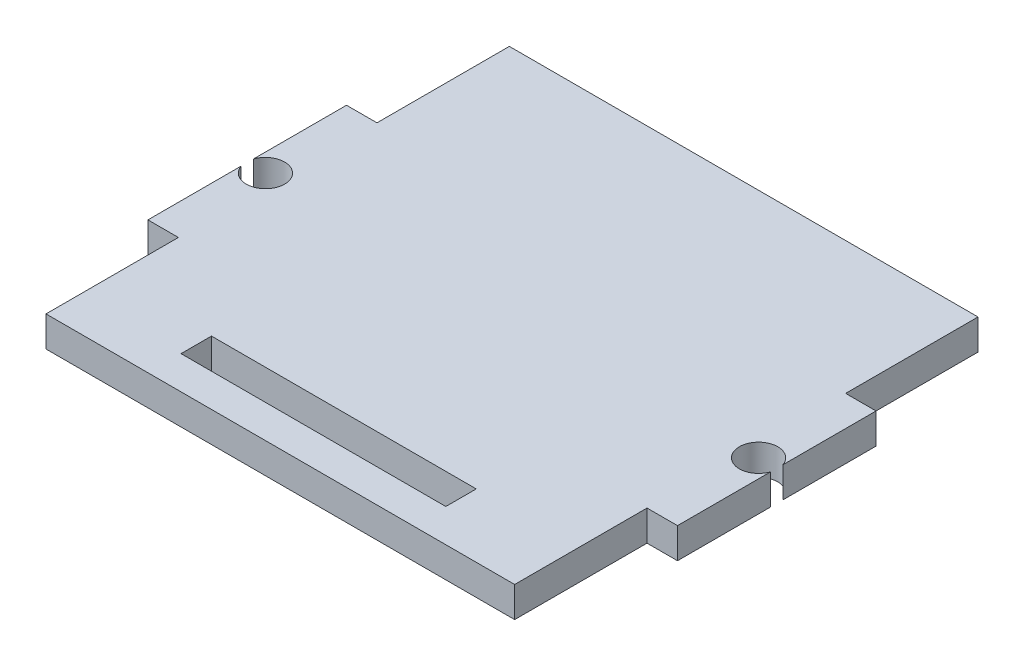
ISO-10303-21;
HEADER;
FILE_DESCRIPTION(('STEP AP214'),'2;1');
FILE_NAME('part.step','',(''),(''),'','','');
FILE_SCHEMA(('AUTOMOTIVE_DESIGN { 1 0 10303 214 1 1 1 1 }'));
ENDSEC;
DATA;
#1=APPLICATION_CONTEXT('core data for automotive mechanical design processes');
#2=APPLICATION_PROTOCOL_DEFINITION('international standard','automotive_design',2000,#1);
#3=PRODUCT_CONTEXT('',#1,'mechanical');
#4=PRODUCT('Part','Part','',(#3));
#5=PRODUCT_RELATED_PRODUCT_CATEGORY('part','',(#4));
#6=PRODUCT_DEFINITION_FORMATION('','',#4);
#7=PRODUCT_DEFINITION_CONTEXT('part definition',#1,'design');
#8=PRODUCT_DEFINITION('design','',#6,#7);
#9=PRODUCT_DEFINITION_SHAPE('','',#8);
#10=(LENGTH_UNIT() NAMED_UNIT(*) SI_UNIT(.MILLI.,.METRE.));
#11=(NAMED_UNIT(*) PLANE_ANGLE_UNIT() SI_UNIT($,.RADIAN.));
#12=(NAMED_UNIT(*) SI_UNIT($,.STERADIAN.) SOLID_ANGLE_UNIT());
#13=UNCERTAINTY_MEASURE_WITH_UNIT(LENGTH_MEASURE(1.E-05),#10,'distance_accuracy_value','');
#14=(GEOMETRIC_REPRESENTATION_CONTEXT(3) GLOBAL_UNCERTAINTY_ASSIGNED_CONTEXT((#13)) GLOBAL_UNIT_ASSIGNED_CONTEXT((#10,
#11,#12)) REPRESENTATION_CONTEXT('',''));
#15=CARTESIAN_POINT('',(0.,0.,0.));
#16=DIRECTION('',(0.,0.,1.));
#17=DIRECTION('',(1.,0.,0.));
#18=AXIS2_PLACEMENT_3D('',#15,#16,#17);
#19=CARTESIAN_POINT('',(1.74625,2.921,-22.225));
#20=DIRECTION('',(0.,1.,0.));
#21=DIRECTION('',(0.,0.,1.));
#22=AXIS2_PLACEMENT_3D('',#19,#20,#21);
#23=PLANE('',#22);
#24=CARTESIAN_POINT('',(1.74625,2.921,-22.225));
#25=DIRECTION('',(0.,-1.,0.));
#26=DIRECTION('',(0.,0.,1.));
#27=AXIS2_PLACEMENT_3D('',#24,#25,#26);
#28=CIRCLE('',#27,1.8415);
#29=CARTESIAN_POINT('',(0.,2.921,-22.8095794963048));
#30=VERTEX_POINT('',#29);
#31=CARTESIAN_POINT('',(0.,2.921,-21.6404205036952));
#32=VERTEX_POINT('',#31);
#33=EDGE_CURVE('E206',#30,#32,#28,.T.);
#34=ORIENTED_EDGE('',*,*,#33,.T.);
#35=DIRECTION('',(0.,0.,1.));
#36=VECTOR('',#35,1.);
#37=CARTESIAN_POINT('',(0.,2.921,-12.7));
#38=LINE('',#37,#36);
#39=CARTESIAN_POINT('',(0.,2.921,-12.7));
#40=VERTEX_POINT('',#39);
#41=EDGE_CURVE('E209',#32,#40,#38,.T.);
#42=ORIENTED_EDGE('',*,*,#41,.T.);
#43=DIRECTION('',(1.,0.,0.));
#44=VECTOR('',#43,1.);
#45=CARTESIAN_POINT('',(0.,2.921,-12.7));
#46=LINE('',#45,#44);
#47=CARTESIAN_POINT('',(2.921,2.921,-12.7));
#48=VERTEX_POINT('',#47);
#49=EDGE_CURVE('E212',#40,#48,#46,.T.);
#50=ORIENTED_EDGE('',*,*,#49,.T.);
#51=DIRECTION('',(0.,0.,1.));
#52=VECTOR('',#51,1.);
#53=CARTESIAN_POINT('',(2.921,2.921,0.));
#54=LINE('',#53,#52);
#55=CARTESIAN_POINT('',(2.921,2.921,0.));
#56=VERTEX_POINT('',#55);
#57=EDGE_CURVE('E214',#48,#56,#54,.T.);
#58=ORIENTED_EDGE('',*,*,#57,.T.);
#59=DIRECTION('',(1.,0.,0.));
#60=VECTOR('',#59,1.);
#61=CARTESIAN_POINT('',(2.921,2.921,0.));
#62=LINE('',#61,#60);
#63=CARTESIAN_POINT('',(47.879,2.921,0.));
#64=VERTEX_POINT('',#63);
#65=EDGE_CURVE('E216',#56,#64,#62,.T.);
#66=ORIENTED_EDGE('',*,*,#65,.T.);
#67=DIRECTION('',(0.,0.,-1.));
#68=VECTOR('',#67,1.);
#69=CARTESIAN_POINT('',(47.879,2.921,0.));
#70=LINE('',#69,#68);
#71=CARTESIAN_POINT('',(47.879,2.921,-12.7));
#72=VERTEX_POINT('',#71);
#73=EDGE_CURVE('E218',#64,#72,#70,.T.);
#74=ORIENTED_EDGE('',*,*,#73,.T.);
#75=DIRECTION('',(1.,0.,0.));
#76=VECTOR('',#75,1.);
#77=CARTESIAN_POINT('',(50.8,2.921,-12.7));
#78=LINE('',#77,#76);
#79=CARTESIAN_POINT('',(50.8,2.921,-12.7));
#80=VERTEX_POINT('',#79);
#81=EDGE_CURVE('E220',#72,#80,#78,.T.);
#82=ORIENTED_EDGE('',*,*,#81,.T.);
#83=DIRECTION('',(0.,0.,-1.));
#84=VECTOR('',#83,1.);
#85=CARTESIAN_POINT('',(50.8,2.921,-12.7));
#86=LINE('',#85,#84);
#87=CARTESIAN_POINT('',(50.8,2.921,-21.6404205036952));
#88=VERTEX_POINT('',#87);
#89=EDGE_CURVE('E222',#80,#88,#86,.T.);
#90=ORIENTED_EDGE('',*,*,#89,.T.);
#91=CARTESIAN_POINT('',(49.05375,2.921,-22.225));
#92=DIRECTION('',(0.,-1.,0.));
#93=DIRECTION('',(0.,0.,-1.));
#94=AXIS2_PLACEMENT_3D('',#91,#92,#93);
#95=CIRCLE('',#94,1.8415);
#96=CARTESIAN_POINT('',(50.8,2.921,-22.8095794963048));
#97=VERTEX_POINT('',#96);
#98=EDGE_CURVE('E224',#88,#97,#95,.T.);
#99=ORIENTED_EDGE('',*,*,#98,.T.);
#100=DIRECTION('',(0.,0.,-1.));
#101=VECTOR('',#100,1.);
#102=CARTESIAN_POINT('',(50.8,2.921,-22.8095794963048));
#103=LINE('',#102,#101);
#104=CARTESIAN_POINT('',(50.8,2.921,-31.75));
#105=VERTEX_POINT('',#104);
#106=EDGE_CURVE('E226',#97,#105,#103,.T.);
#107=ORIENTED_EDGE('',*,*,#106,.T.);
#108=DIRECTION('',(-1.,0.,0.));
#109=VECTOR('',#108,1.);
#110=CARTESIAN_POINT('',(50.8,2.921,-31.75));
#111=LINE('',#110,#109);
#112=CARTESIAN_POINT('',(47.879,2.921,-31.75));
#113=VERTEX_POINT('',#112);
#114=EDGE_CURVE('E228',#105,#113,#111,.T.);
#115=ORIENTED_EDGE('',*,*,#114,.T.);
#116=DIRECTION('',(0.,0.,-1.));
#117=VECTOR('',#116,1.);
#118=CARTESIAN_POINT('',(47.879,2.921,-44.45));
#119=LINE('',#118,#117);
#120=CARTESIAN_POINT('',(47.879,2.921,-44.45));
#121=VERTEX_POINT('',#120);
#122=EDGE_CURVE('E230',#113,#121,#119,.T.);
#123=ORIENTED_EDGE('',*,*,#122,.T.);
#124=DIRECTION('',(-1.,0.,0.));
#125=VECTOR('',#124,1.);
#126=CARTESIAN_POINT('',(2.921,2.921,-44.45));
#127=LINE('',#126,#125);
#128=CARTESIAN_POINT('',(2.921,2.921,-44.45));
#129=VERTEX_POINT('',#128);
#130=EDGE_CURVE('E232',#121,#129,#127,.T.);
#131=ORIENTED_EDGE('',*,*,#130,.T.);
#132=DIRECTION('',(0.,0.,1.));
#133=VECTOR('',#132,1.);
#134=CARTESIAN_POINT('',(2.921,2.921,-44.45));
#135=LINE('',#134,#133);
#136=CARTESIAN_POINT('',(2.921,2.921,-31.75));
#137=VERTEX_POINT('',#136);
#138=EDGE_CURVE('E234',#129,#137,#135,.T.);
#139=ORIENTED_EDGE('',*,*,#138,.T.);
#140=DIRECTION('',(-1.,0.,0.));
#141=VECTOR('',#140,1.);
#142=CARTESIAN_POINT('',(0.,2.921,-31.75));
#143=LINE('',#142,#141);
#144=CARTESIAN_POINT('',(0.,2.921,-31.75));
#145=VERTEX_POINT('',#144);
#146=EDGE_CURVE('E236',#137,#145,#143,.T.);
#147=ORIENTED_EDGE('',*,*,#146,.T.);
#148=DIRECTION('',(0.,0.,1.));
#149=VECTOR('',#148,1.);
#150=CARTESIAN_POINT('',(0.,2.921,-22.8095794963048));
#151=LINE('',#150,#149);
#152=EDGE_CURVE('E238',#145,#30,#151,.T.);
#153=ORIENTED_EDGE('',*,*,#152,.T.);
#154=EDGE_LOOP('',(#34,#42,#50,#58,#66,#74,#82,#90,#99,#107,#115,#123,#131,#139,#147,#153));
#155=FACE_BOUND('',#154,.T.);
#156=DIRECTION('',(1.,0.,0.));
#157=VECTOR('',#156,1.);
#158=CARTESIAN_POINT('',(12.7,2.921,-3.175));
#159=LINE('',#158,#157);
#160=CARTESIAN_POINT('',(12.7,2.921,-3.175));
#161=VERTEX_POINT('',#160);
#162=CARTESIAN_POINT('',(38.1,2.921,-3.175));
#163=VERTEX_POINT('',#162);
#164=EDGE_CURVE('E178',#161,#163,#159,.T.);
#165=ORIENTED_EDGE('',*,*,#164,.F.);
#166=DIRECTION('',(0.,0.,1.));
#167=VECTOR('',#166,1.);
#168=CARTESIAN_POINT('',(12.7,2.921,-6.096));
#169=LINE('',#168,#167);
#170=CARTESIAN_POINT('',(12.7,2.921,-6.096));
#171=VERTEX_POINT('',#170);
#172=EDGE_CURVE('E170',#171,#161,#169,.T.);
#173=ORIENTED_EDGE('',*,*,#172,.F.);
#174=DIRECTION('',(-1.,0.,0.));
#175=VECTOR('',#174,1.);
#176=CARTESIAN_POINT('',(12.7,2.921,-6.096));
#177=LINE('',#176,#175);
#178=CARTESIAN_POINT('',(38.1,2.921,-6.096));
#179=VERTEX_POINT('',#178);
#180=EDGE_CURVE('E192',#179,#171,#177,.T.);
#181=ORIENTED_EDGE('',*,*,#180,.F.);
#182=DIRECTION('',(0.,0.,-1.));
#183=VECTOR('',#182,1.);
#184=CARTESIAN_POINT('',(38.1,2.921,-6.096));
#185=LINE('',#184,#183);
#186=EDGE_CURVE('E190',#163,#179,#185,.T.);
#187=ORIENTED_EDGE('',*,*,#186,.F.);
#188=EDGE_LOOP('',(#165,#173,#181,#187));
#189=FACE_BOUND('',#188,.T.);
#190=ADVANCED_FACE('F33',(#155,#189),#23,.T.);
#191=CARTESIAN_POINT('',(1.74625,0.,-22.225));
#192=DIRECTION('',(0.,1.,0.));
#193=DIRECTION('',(0.,0.,1.));
#194=AXIS2_PLACEMENT_3D('',#191,#192,#193);
#195=PLANE('',#194);
#196=CARTESIAN_POINT('',(1.74625,0.,-22.225));
#197=DIRECTION('',(0.,-1.,0.));
#198=DIRECTION('',(0.,0.,1.));
#199=AXIS2_PLACEMENT_3D('',#196,#197,#198);
#200=CIRCLE('',#199,1.8415);
#201=CARTESIAN_POINT('',(0.,0.,-22.8095794963048));
#202=VERTEX_POINT('',#201);
#203=CARTESIAN_POINT('',(0.,0.,-21.6404205036952));
#204=VERTEX_POINT('',#203);
#205=EDGE_CURVE('E186',#202,#204,#200,.T.);
#206=ORIENTED_EDGE('',*,*,#205,.F.);
#207=DIRECTION('',(0.,0.,1.));
#208=VECTOR('',#207,1.);
#209=CARTESIAN_POINT('',(0.,0.,-22.8095794963048));
#210=LINE('',#209,#208);
#211=CARTESIAN_POINT('',(0.,0.,-31.75));
#212=VERTEX_POINT('',#211);
#213=EDGE_CURVE('E210',#212,#202,#210,.T.);
#214=ORIENTED_EDGE('',*,*,#213,.F.);
#215=DIRECTION('',(-1.,0.,0.));
#216=VECTOR('',#215,1.);
#217=CARTESIAN_POINT('',(0.,0.,-31.75));
#218=LINE('',#217,#216);
#219=CARTESIAN_POINT('',(2.921,0.,-31.75));
#220=VERTEX_POINT('',#219);
#221=EDGE_CURVE('E269',#220,#212,#218,.T.);
#222=ORIENTED_EDGE('',*,*,#221,.F.);
#223=DIRECTION('',(0.,0.,1.));
#224=VECTOR('',#223,1.);
#225=CARTESIAN_POINT('',(2.921,0.,-44.45));
#226=LINE('',#225,#224);
#227=CARTESIAN_POINT('',(2.921,0.,-44.45));
#228=VERTEX_POINT('',#227);
#229=EDGE_CURVE('E267',#228,#220,#226,.T.);
#230=ORIENTED_EDGE('',*,*,#229,.F.);
#231=DIRECTION('',(-1.,0.,0.));
#232=VECTOR('',#231,1.);
#233=CARTESIAN_POINT('',(2.921,0.,-44.45));
#234=LINE('',#233,#232);
#235=CARTESIAN_POINT('',(47.879,0.,-44.45));
#236=VERTEX_POINT('',#235);
#237=EDGE_CURVE('E265',#236,#228,#234,.T.);
#238=ORIENTED_EDGE('',*,*,#237,.F.);
#239=DIRECTION('',(0.,0.,-1.));
#240=VECTOR('',#239,1.);
#241=CARTESIAN_POINT('',(47.879,0.,-44.45));
#242=LINE('',#241,#240);
#243=CARTESIAN_POINT('',(47.879,0.,-31.75));
#244=VERTEX_POINT('',#243);
#245=EDGE_CURVE('E263',#244,#236,#242,.T.);
#246=ORIENTED_EDGE('',*,*,#245,.F.);
#247=DIRECTION('',(-1.,0.,0.));
#248=VECTOR('',#247,1.);
#249=CARTESIAN_POINT('',(50.8,0.,-31.75));
#250=LINE('',#249,#248);
#251=CARTESIAN_POINT('',(50.8,0.,-31.75));
#252=VERTEX_POINT('',#251);
#253=EDGE_CURVE('E261',#252,#244,#250,.T.);
#254=ORIENTED_EDGE('',*,*,#253,.F.);
#255=DIRECTION('',(0.,0.,-1.));
#256=VECTOR('',#255,1.);
#257=CARTESIAN_POINT('',(50.8,0.,-22.8095794963048));
#258=LINE('',#257,#256);
#259=CARTESIAN_POINT('',(50.8,0.,-22.8095794963048));
#260=VERTEX_POINT('',#259);
#261=EDGE_CURVE('E259',#260,#252,#258,.T.);
#262=ORIENTED_EDGE('',*,*,#261,.F.);
#263=CARTESIAN_POINT('',(49.05375,0.,-22.225));
#264=DIRECTION('',(0.,-1.,0.));
#265=DIRECTION('',(0.,0.,-1.));
#266=AXIS2_PLACEMENT_3D('',#263,#264,#265);
#267=CIRCLE('',#266,1.8415);
#268=CARTESIAN_POINT('',(50.8,0.,-21.6404205036952));
#269=VERTEX_POINT('',#268);
#270=EDGE_CURVE('E257',#269,#260,#267,.T.);
#271=ORIENTED_EDGE('',*,*,#270,.F.);
#272=DIRECTION('',(0.,0.,-1.));
#273=VECTOR('',#272,1.);
#274=CARTESIAN_POINT('',(50.8,0.,-12.7));
#275=LINE('',#274,#273);
#276=CARTESIAN_POINT('',(50.8,0.,-12.7));
#277=VERTEX_POINT('',#276);
#278=EDGE_CURVE('E255',#277,#269,#275,.T.);
#279=ORIENTED_EDGE('',*,*,#278,.F.);
#280=DIRECTION('',(1.,0.,0.));
#281=VECTOR('',#280,1.);
#282=CARTESIAN_POINT('',(50.8,0.,-12.7));
#283=LINE('',#282,#281);
#284=CARTESIAN_POINT('',(47.879,0.,-12.7));
#285=VERTEX_POINT('',#284);
#286=EDGE_CURVE('E253',#285,#277,#283,.T.);
#287=ORIENTED_EDGE('',*,*,#286,.F.);
#288=DIRECTION('',(0.,0.,-1.));
#289=VECTOR('',#288,1.);
#290=CARTESIAN_POINT('',(47.879,0.,0.));
#291=LINE('',#290,#289);
#292=CARTESIAN_POINT('',(47.879,0.,0.));
#293=VERTEX_POINT('',#292);
#294=EDGE_CURVE('E251',#293,#285,#291,.T.);
#295=ORIENTED_EDGE('',*,*,#294,.F.);
#296=DIRECTION('',(1.,0.,0.));
#297=VECTOR('',#296,1.);
#298=CARTESIAN_POINT('',(2.921,0.,0.));
#299=LINE('',#298,#297);
#300=CARTESIAN_POINT('',(2.921,0.,0.));
#301=VERTEX_POINT('',#300);
#302=EDGE_CURVE('E249',#301,#293,#299,.T.);
#303=ORIENTED_EDGE('',*,*,#302,.F.);
#304=DIRECTION('',(0.,0.,1.));
#305=VECTOR('',#304,1.);
#306=CARTESIAN_POINT('',(2.921,0.,0.));
#307=LINE('',#306,#305);
#308=CARTESIAN_POINT('',(2.921,0.,-12.7));
#309=VERTEX_POINT('',#308);
#310=EDGE_CURVE('E247',#309,#301,#307,.T.);
#311=ORIENTED_EDGE('',*,*,#310,.F.);
#312=DIRECTION('',(1.,0.,0.));
#313=VECTOR('',#312,1.);
#314=CARTESIAN_POINT('',(0.,0.,-12.7));
#315=LINE('',#314,#313);
#316=CARTESIAN_POINT('',(0.,0.,-12.7));
#317=VERTEX_POINT('',#316);
#318=EDGE_CURVE('E245',#317,#309,#315,.T.);
#319=ORIENTED_EDGE('',*,*,#318,.F.);
#320=DIRECTION('',(0.,0.,1.));
#321=VECTOR('',#320,1.);
#322=CARTESIAN_POINT('',(0.,0.,-12.7));
#323=LINE('',#322,#321);
#324=EDGE_CURVE('E243',#204,#317,#323,.T.);
#325=ORIENTED_EDGE('',*,*,#324,.F.);
#326=EDGE_LOOP('',(#206,#214,#222,#230,#238,#246,#254,#262,#271,#279,#287,#295,#303,#311,#319,#325));
#327=FACE_BOUND('',#326,.T.);
#328=DIRECTION('',(0.,0.,1.));
#329=VECTOR('',#328,1.);
#330=CARTESIAN_POINT('',(12.7,0.,-6.096));
#331=LINE('',#330,#329);
#332=CARTESIAN_POINT('',(12.7,0.,-6.096));
#333=VERTEX_POINT('',#332);
#334=CARTESIAN_POINT('',(12.7,0.,-3.175));
#335=VERTEX_POINT('',#334);
#336=EDGE_CURVE('E56',#333,#335,#331,.T.);
#337=ORIENTED_EDGE('',*,*,#336,.T.);
#338=DIRECTION('',(1.,0.,0.));
#339=VECTOR('',#338,1.);
#340=CARTESIAN_POINT('',(12.7,0.,-3.175));
#341=LINE('',#340,#339);
#342=CARTESIAN_POINT('',(38.1,0.,-3.175));
#343=VERTEX_POINT('',#342);
#344=EDGE_CURVE('E185',#335,#343,#341,.T.);
#345=ORIENTED_EDGE('',*,*,#344,.T.);
#346=DIRECTION('',(0.,0.,-1.));
#347=VECTOR('',#346,1.);
#348=CARTESIAN_POINT('',(38.1,0.,-6.096));
#349=LINE('',#348,#347);
#350=CARTESIAN_POINT('',(38.1,0.,-6.096));
#351=VERTEX_POINT('',#350);
#352=EDGE_CURVE('E198',#343,#351,#349,.T.);
#353=ORIENTED_EDGE('',*,*,#352,.T.);
#354=DIRECTION('',(-1.,0.,0.));
#355=VECTOR('',#354,1.);
#356=CARTESIAN_POINT('',(12.7,0.,-6.096));
#357=LINE('',#356,#355);
#358=EDGE_CURVE('E179',#351,#333,#357,.T.);
#359=ORIENTED_EDGE('',*,*,#358,.T.);
#360=EDGE_LOOP('',(#337,#345,#353,#359));
#361=FACE_BOUND('',#360,.T.);
#362=ADVANCED_FACE('F323',(#327,#361),#195,.F.);
#363=CARTESIAN_POINT('',(1.74625,2.921,-22.225));
#364=DIRECTION('',(0.,-1.,0.));
#365=DIRECTION('',(0.,0.,-1.));
#366=AXIS2_PLACEMENT_3D('',#363,#364,#365);
#367=CYLINDRICAL_SURFACE('',#366,1.8415);
#368=ORIENTED_EDGE('',*,*,#205,.T.);
#369=DIRECTION('',(0.,-1.,0.));
#370=VECTOR('',#369,1.);
#371=CARTESIAN_POINT('',(0.,2.921,-21.6404205036952));
#372=LINE('',#371,#370);
#373=EDGE_CURVE('E11',#32,#204,#372,.T.);
#374=ORIENTED_EDGE('',*,*,#373,.F.);
#375=ORIENTED_EDGE('',*,*,#33,.F.);
#376=DIRECTION('',(0.,-1.,0.));
#377=VECTOR('',#376,1.);
#378=CARTESIAN_POINT('',(0.,2.921,-22.8095794963048));
#379=LINE('',#378,#377);
#380=EDGE_CURVE('E240',#30,#202,#379,.T.);
#381=ORIENTED_EDGE('',*,*,#380,.T.);
#382=EDGE_LOOP('',(#368,#374,#375,#381));
#383=FACE_BOUND('',#382,.T.);
#384=ADVANCED_FACE('F35',(#383),#367,.F.);
#385=CARTESIAN_POINT('',(0.,2.921,-12.7));
#386=DIRECTION('',(1.,0.,0.));
#387=DIRECTION('',(0.,0.,-1.));
#388=AXIS2_PLACEMENT_3D('',#385,#386,#387);
#389=PLANE('',#388);
#390=ORIENTED_EDGE('',*,*,#324,.T.);
#391=DIRECTION('',(0.,-1.,0.));
#392=VECTOR('',#391,1.);
#393=CARTESIAN_POINT('',(0.,2.921,-12.7));
#394=LINE('',#393,#392);
#395=EDGE_CURVE('E41',#40,#317,#394,.T.);
#396=ORIENTED_EDGE('',*,*,#395,.F.);
#397=ORIENTED_EDGE('',*,*,#41,.F.);
#398=ORIENTED_EDGE('',*,*,#373,.T.);
#399=EDGE_LOOP('',(#390,#396,#397,#398));
#400=FACE_BOUND('',#399,.T.);
#401=ADVANCED_FACE('F340',(#400),#389,.F.);
#402=CARTESIAN_POINT('',(0.,2.921,-12.7));
#403=DIRECTION('',(0.,0.,-1.));
#404=DIRECTION('',(-1.,0.,0.));
#405=AXIS2_PLACEMENT_3D('',#402,#403,#404);
#406=PLANE('',#405);
#407=ORIENTED_EDGE('',*,*,#318,.T.);
#408=DIRECTION('',(0.,-1.,0.));
#409=VECTOR('',#408,1.);
#410=CARTESIAN_POINT('',(2.921,2.921,-12.7));
#411=LINE('',#410,#409);
#412=EDGE_CURVE('E310',#48,#309,#411,.T.);
#413=ORIENTED_EDGE('',*,*,#412,.F.);
#414=ORIENTED_EDGE('',*,*,#49,.F.);
#415=ORIENTED_EDGE('',*,*,#395,.T.);
#416=EDGE_LOOP('',(#407,#413,#414,#415));
#417=FACE_BOUND('',#416,.T.);
#418=ADVANCED_FACE('F317',(#417),#406,.F.);
#419=CARTESIAN_POINT('',(2.921,2.921,0.));
#420=DIRECTION('',(1.,0.,0.));
#421=DIRECTION('',(0.,0.,-1.));
#422=AXIS2_PLACEMENT_3D('',#419,#420,#421);
#423=PLANE('',#422);
#424=ORIENTED_EDGE('',*,*,#310,.T.);
#425=DIRECTION('',(0.,-1.,0.));
#426=VECTOR('',#425,1.);
#427=CARTESIAN_POINT('',(2.921,2.921,0.));
#428=LINE('',#427,#426);
#429=EDGE_CURVE('E307',#56,#301,#428,.T.);
#430=ORIENTED_EDGE('',*,*,#429,.F.);
#431=ORIENTED_EDGE('',*,*,#57,.F.);
#432=ORIENTED_EDGE('',*,*,#412,.T.);
#433=EDGE_LOOP('',(#424,#430,#431,#432));
#434=FACE_BOUND('',#433,.T.);
#435=ADVANCED_FACE('F329',(#434),#423,.F.);
#436=CARTESIAN_POINT('',(2.921,2.921,0.));
#437=DIRECTION('',(0.,0.,-1.));
#438=DIRECTION('',(-1.,0.,0.));
#439=AXIS2_PLACEMENT_3D('',#436,#437,#438);
#440=PLANE('',#439);
#441=ORIENTED_EDGE('',*,*,#302,.T.);
#442=DIRECTION('',(0.,-1.,0.));
#443=VECTOR('',#442,1.);
#444=CARTESIAN_POINT('',(47.879,2.921,0.));
#445=LINE('',#444,#443);
#446=EDGE_CURVE('E304',#64,#293,#445,.T.);
#447=ORIENTED_EDGE('',*,*,#446,.F.);
#448=ORIENTED_EDGE('',*,*,#65,.F.);
#449=ORIENTED_EDGE('',*,*,#429,.T.);
#450=EDGE_LOOP('',(#441,#447,#448,#449));
#451=FACE_BOUND('',#450,.T.);
#452=ADVANCED_FACE('F333',(#451),#440,.F.);
#453=CARTESIAN_POINT('',(47.879,2.921,0.));
#454=DIRECTION('',(-1.,0.,0.));
#455=DIRECTION('',(0.,0.,1.));
#456=AXIS2_PLACEMENT_3D('',#453,#454,#455);
#457=PLANE('',#456);
#458=ORIENTED_EDGE('',*,*,#294,.T.);
#459=DIRECTION('',(0.,-1.,0.));
#460=VECTOR('',#459,1.);
#461=CARTESIAN_POINT('',(47.879,2.921,-12.7));
#462=LINE('',#461,#460);
#463=EDGE_CURVE('E301',#72,#285,#462,.T.);
#464=ORIENTED_EDGE('',*,*,#463,.F.);
#465=ORIENTED_EDGE('',*,*,#73,.F.);
#466=ORIENTED_EDGE('',*,*,#446,.T.);
#467=EDGE_LOOP('',(#458,#464,#465,#466));
#468=FACE_BOUND('',#467,.T.);
#469=ADVANCED_FACE('F393',(#468),#457,.F.);
#470=CARTESIAN_POINT('',(50.8,2.921,-12.7));
#471=DIRECTION('',(0.,0.,-1.));
#472=DIRECTION('',(-1.,0.,0.));
#473=AXIS2_PLACEMENT_3D('',#470,#471,#472);
#474=PLANE('',#473);
#475=ORIENTED_EDGE('',*,*,#286,.T.);
#476=DIRECTION('',(0.,-1.,0.));
#477=VECTOR('',#476,1.);
#478=CARTESIAN_POINT('',(50.8,2.921,-12.7));
#479=LINE('',#478,#477);
#480=EDGE_CURVE('E298',#80,#277,#479,.T.);
#481=ORIENTED_EDGE('',*,*,#480,.F.);
#482=ORIENTED_EDGE('',*,*,#81,.F.);
#483=ORIENTED_EDGE('',*,*,#463,.T.);
#484=EDGE_LOOP('',(#475,#481,#482,#483));
#485=FACE_BOUND('',#484,.T.);
#486=ADVANCED_FACE('F390',(#485),#474,.F.);
#487=CARTESIAN_POINT('',(50.8,2.921,-12.7));
#488=DIRECTION('',(-1.,0.,0.));
#489=DIRECTION('',(0.,0.,1.));
#490=AXIS2_PLACEMENT_3D('',#487,#488,#489);
#491=PLANE('',#490);
#492=ORIENTED_EDGE('',*,*,#278,.T.);
#493=DIRECTION('',(0.,-1.,0.));
#494=VECTOR('',#493,1.);
#495=CARTESIAN_POINT('',(50.8,2.921,-21.6404205036952));
#496=LINE('',#495,#494);
#497=EDGE_CURVE('E295',#88,#269,#496,.T.);
#498=ORIENTED_EDGE('',*,*,#497,.F.);
#499=ORIENTED_EDGE('',*,*,#89,.F.);
#500=ORIENTED_EDGE('',*,*,#480,.T.);
#501=EDGE_LOOP('',(#492,#498,#499,#500));
#502=FACE_BOUND('',#501,.T.);
#503=ADVANCED_FACE('F386',(#502),#491,.F.);
#504=CARTESIAN_POINT('',(49.05375,2.921,-22.225));
#505=DIRECTION('',(0.,-1.,0.));
#506=DIRECTION('',(0.,0.,-1.));
#507=AXIS2_PLACEMENT_3D('',#504,#505,#506);
#508=CYLINDRICAL_SURFACE('',#507,1.8415);
#509=ORIENTED_EDGE('',*,*,#270,.T.);
#510=DIRECTION('',(0.,-1.,0.));
#511=VECTOR('',#510,1.);
#512=CARTESIAN_POINT('',(50.8,2.921,-22.8095794963048));
#513=LINE('',#512,#511);
#514=EDGE_CURVE('E292',#97,#260,#513,.T.);
#515=ORIENTED_EDGE('',*,*,#514,.F.);
#516=ORIENTED_EDGE('',*,*,#98,.F.);
#517=ORIENTED_EDGE('',*,*,#497,.T.);
#518=EDGE_LOOP('',(#509,#515,#516,#517));
#519=FACE_BOUND('',#518,.T.);
#520=ADVANCED_FACE('F382',(#519),#508,.F.);
#521=CARTESIAN_POINT('',(50.8,2.921,-22.8095794963048));
#522=DIRECTION('',(-1.,0.,0.));
#523=DIRECTION('',(0.,0.,1.));
#524=AXIS2_PLACEMENT_3D('',#521,#522,#523);
#525=PLANE('',#524);
#526=ORIENTED_EDGE('',*,*,#261,.T.);
#527=DIRECTION('',(0.,-1.,0.));
#528=VECTOR('',#527,1.);
#529=CARTESIAN_POINT('',(50.8,2.921,-31.75));
#530=LINE('',#529,#528);
#531=EDGE_CURVE('E289',#105,#252,#530,.T.);
#532=ORIENTED_EDGE('',*,*,#531,.F.);
#533=ORIENTED_EDGE('',*,*,#106,.F.);
#534=ORIENTED_EDGE('',*,*,#514,.T.);
#535=EDGE_LOOP('',(#526,#532,#533,#534));
#536=FACE_BOUND('',#535,.T.);
#537=ADVANCED_FACE('F377',(#536),#525,.F.);
#538=CARTESIAN_POINT('',(50.8,2.921,-31.75));
#539=DIRECTION('',(0.,0.,1.));
#540=DIRECTION('',(1.,0.,0.));
#541=AXIS2_PLACEMENT_3D('',#538,#539,#540);
#542=PLANE('',#541);
#543=ORIENTED_EDGE('',*,*,#253,.T.);
#544=DIRECTION('',(0.,-1.,0.));
#545=VECTOR('',#544,1.);
#546=CARTESIAN_POINT('',(47.879,2.921,-31.75));
#547=LINE('',#546,#545);
#548=EDGE_CURVE('E286',#113,#244,#547,.T.);
#549=ORIENTED_EDGE('',*,*,#548,.F.);
#550=ORIENTED_EDGE('',*,*,#114,.F.);
#551=ORIENTED_EDGE('',*,*,#531,.T.);
#552=EDGE_LOOP('',(#543,#549,#550,#551));
#553=FACE_BOUND('',#552,.T.);
#554=ADVANCED_FACE('F371',(#553),#542,.F.);
#555=CARTESIAN_POINT('',(47.879,2.921,-44.45));
#556=DIRECTION('',(-1.,0.,0.));
#557=DIRECTION('',(0.,0.,1.));
#558=AXIS2_PLACEMENT_3D('',#555,#556,#557);
#559=PLANE('',#558);
#560=ORIENTED_EDGE('',*,*,#245,.T.);
#561=DIRECTION('',(0.,-1.,0.));
#562=VECTOR('',#561,1.);
#563=CARTESIAN_POINT('',(47.879,2.921,-44.45));
#564=LINE('',#563,#562);
#565=EDGE_CURVE('E283',#121,#236,#564,.T.);
#566=ORIENTED_EDGE('',*,*,#565,.F.);
#567=ORIENTED_EDGE('',*,*,#122,.F.);
#568=ORIENTED_EDGE('',*,*,#548,.T.);
#569=EDGE_LOOP('',(#560,#566,#567,#568));
#570=FACE_BOUND('',#569,.T.);
#571=ADVANCED_FACE('F367',(#570),#559,.F.);
#572=CARTESIAN_POINT('',(2.921,2.921,-44.45));
#573=DIRECTION('',(0.,0.,1.));
#574=DIRECTION('',(1.,0.,0.));
#575=AXIS2_PLACEMENT_3D('',#572,#573,#574);
#576=PLANE('',#575);
#577=ORIENTED_EDGE('',*,*,#237,.T.);
#578=DIRECTION('',(0.,-1.,0.));
#579=VECTOR('',#578,1.);
#580=CARTESIAN_POINT('',(2.921,2.921,-44.45));
#581=LINE('',#580,#579);
#582=EDGE_CURVE('E280',#129,#228,#581,.T.);
#583=ORIENTED_EDGE('',*,*,#582,.F.);
#584=ORIENTED_EDGE('',*,*,#130,.F.);
#585=ORIENTED_EDGE('',*,*,#565,.T.);
#586=EDGE_LOOP('',(#577,#583,#584,#585));
#587=FACE_BOUND('',#586,.T.);
#588=ADVANCED_FACE('F362',(#587),#576,.F.);
#589=CARTESIAN_POINT('',(2.921,2.921,-44.45));
#590=DIRECTION('',(1.,0.,0.));
#591=DIRECTION('',(0.,0.,-1.));
#592=AXIS2_PLACEMENT_3D('',#589,#590,#591);
#593=PLANE('',#592);
#594=ORIENTED_EDGE('',*,*,#229,.T.);
#595=DIRECTION('',(0.,-1.,0.));
#596=VECTOR('',#595,1.);
#597=CARTESIAN_POINT('',(2.921,2.921,-31.75));
#598=LINE('',#597,#596);
#599=EDGE_CURVE('E277',#137,#220,#598,.T.);
#600=ORIENTED_EDGE('',*,*,#599,.F.);
#601=ORIENTED_EDGE('',*,*,#138,.F.);
#602=ORIENTED_EDGE('',*,*,#582,.T.);
#603=EDGE_LOOP('',(#594,#600,#601,#602));
#604=FACE_BOUND('',#603,.T.);
#605=ADVANCED_FACE('F356',(#604),#593,.F.);
#606=CARTESIAN_POINT('',(0.,2.921,-31.75));
#607=DIRECTION('',(0.,0.,1.));
#608=DIRECTION('',(1.,0.,0.));
#609=AXIS2_PLACEMENT_3D('',#606,#607,#608);
#610=PLANE('',#609);
#611=ORIENTED_EDGE('',*,*,#221,.T.);
#612=DIRECTION('',(0.,-1.,0.));
#613=VECTOR('',#612,1.);
#614=CARTESIAN_POINT('',(0.,2.921,-31.75));
#615=LINE('',#614,#613);
#616=EDGE_CURVE('E274',#145,#212,#615,.T.);
#617=ORIENTED_EDGE('',*,*,#616,.F.);
#618=ORIENTED_EDGE('',*,*,#146,.F.);
#619=ORIENTED_EDGE('',*,*,#599,.T.);
#620=EDGE_LOOP('',(#611,#617,#618,#619));
#621=FACE_BOUND('',#620,.T.);
#622=ADVANCED_FACE('F352',(#621),#610,.F.);
#623=CARTESIAN_POINT('',(0.,2.921,-22.8095794963048));
#624=DIRECTION('',(1.,0.,0.));
#625=DIRECTION('',(0.,0.,-1.));
#626=AXIS2_PLACEMENT_3D('',#623,#624,#625);
#627=PLANE('',#626);
#628=ORIENTED_EDGE('',*,*,#213,.T.);
#629=ORIENTED_EDGE('',*,*,#380,.F.);
#630=ORIENTED_EDGE('',*,*,#152,.F.);
#631=ORIENTED_EDGE('',*,*,#616,.T.);
#632=EDGE_LOOP('',(#628,#629,#630,#631));
#633=FACE_BOUND('',#632,.T.);
#634=ADVANCED_FACE('F347',(#633),#627,.F.);
#635=CARTESIAN_POINT('',(12.7,2.921,-6.096));
#636=DIRECTION('',(1.,0.,0.));
#637=DIRECTION('',(0.,0.,-1.));
#638=AXIS2_PLACEMENT_3D('',#635,#636,#637);
#639=PLANE('',#638);
#640=ORIENTED_EDGE('',*,*,#336,.F.);
#641=DIRECTION('',(0.,-1.,0.));
#642=VECTOR('',#641,1.);
#643=CARTESIAN_POINT('',(12.7,2.921,-6.096));
#644=LINE('',#643,#642);
#645=EDGE_CURVE('E174',#171,#333,#644,.T.);
#646=ORIENTED_EDGE('',*,*,#645,.F.);
#647=ORIENTED_EDGE('',*,*,#172,.T.);
#648=DIRECTION('',(0.,-1.,0.));
#649=VECTOR('',#648,1.);
#650=CARTESIAN_POINT('',(12.7,2.921,-3.175));
#651=LINE('',#650,#649);
#652=EDGE_CURVE('E173',#161,#335,#651,.T.);
#653=ORIENTED_EDGE('',*,*,#652,.T.);
#654=EDGE_LOOP('',(#640,#646,#647,#653));
#655=FACE_BOUND('',#654,.T.);
#656=ADVANCED_FACE('F172',(#655),#639,.T.);
#657=CARTESIAN_POINT('',(12.7,2.921,-3.175));
#658=DIRECTION('',(0.,0.,-1.));
#659=DIRECTION('',(-1.,0.,0.));
#660=AXIS2_PLACEMENT_3D('',#657,#658,#659);
#661=PLANE('',#660);
#662=ORIENTED_EDGE('',*,*,#344,.F.);
#663=ORIENTED_EDGE('',*,*,#652,.F.);
#664=ORIENTED_EDGE('',*,*,#164,.T.);
#665=DIRECTION('',(0.,-1.,0.));
#666=VECTOR('',#665,1.);
#667=CARTESIAN_POINT('',(38.1,2.921,-3.175));
#668=LINE('',#667,#666);
#669=EDGE_CURVE('E187',#163,#343,#668,.T.);
#670=ORIENTED_EDGE('',*,*,#669,.T.);
#671=EDGE_LOOP('',(#662,#663,#664,#670));
#672=FACE_BOUND('',#671,.T.);
#673=ADVANCED_FACE('F182',(#672),#661,.T.);
#674=CARTESIAN_POINT('',(38.1,2.921,-6.096));
#675=DIRECTION('',(-1.,0.,0.));
#676=DIRECTION('',(0.,0.,1.));
#677=AXIS2_PLACEMENT_3D('',#674,#675,#676);
#678=PLANE('',#677);
#679=ORIENTED_EDGE('',*,*,#352,.F.);
#680=ORIENTED_EDGE('',*,*,#669,.F.);
#681=ORIENTED_EDGE('',*,*,#186,.T.);
#682=DIRECTION('',(0.,-1.,0.));
#683=VECTOR('',#682,1.);
#684=CARTESIAN_POINT('',(38.1,2.921,-6.096));
#685=LINE('',#684,#683);
#686=EDGE_CURVE('E48',#179,#351,#685,.T.);
#687=ORIENTED_EDGE('',*,*,#686,.T.);
#688=EDGE_LOOP('',(#679,#680,#681,#687));
#689=FACE_BOUND('',#688,.T.);
#690=ADVANCED_FACE('F475',(#689),#678,.T.);
#691=CARTESIAN_POINT('',(12.7,2.921,-6.096));
#692=DIRECTION('',(0.,0.,1.));
#693=DIRECTION('',(1.,0.,0.));
#694=AXIS2_PLACEMENT_3D('',#691,#692,#693);
#695=PLANE('',#694);
#696=ORIENTED_EDGE('',*,*,#358,.F.);
#697=ORIENTED_EDGE('',*,*,#686,.F.);
#698=ORIENTED_EDGE('',*,*,#180,.T.);
#699=ORIENTED_EDGE('',*,*,#645,.T.);
#700=EDGE_LOOP('',(#696,#697,#698,#699));
#701=FACE_BOUND('',#700,.T.);
#702=ADVANCED_FACE('F481',(#701),#695,.T.);
#703=CLOSED_SHELL('',(#190,#362,#384,#401,#418,#435,#452,#469,#486,#503,#520,#537,#554,#571,
#588,#605,#622,#634,#656,#673,#690,#702));
#704=MANIFOLD_SOLID_BREP('B2',#703);
#705=ADVANCED_BREP_SHAPE_REPRESENTATION('',(#18,#704),#14);
#706=SHAPE_DEFINITION_REPRESENTATION(#9,#705);
ENDSEC;
END-ISO-10303-21;
